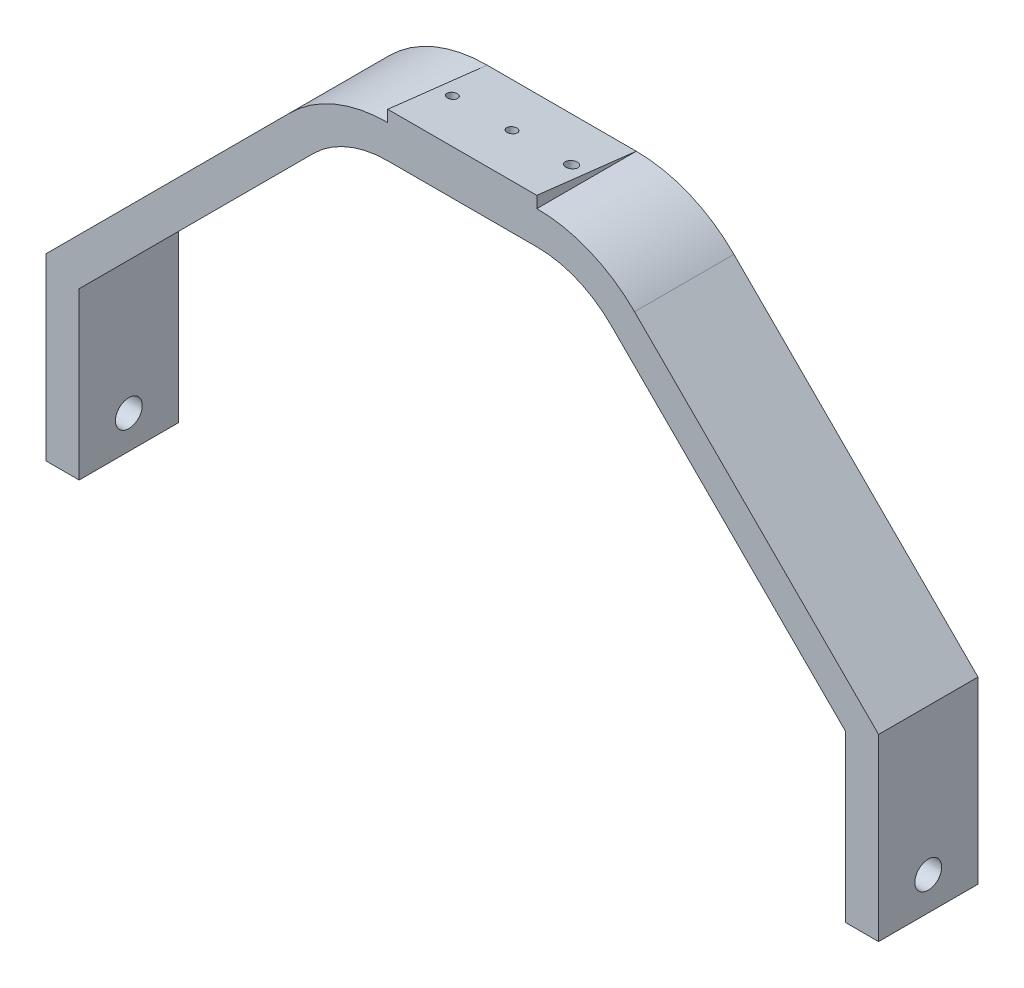
ISO-10303-21;
HEADER;
FILE_DESCRIPTION(('STEP AP214'),'2;1');
FILE_NAME('part.step','',(''),(''),'','','');
FILE_SCHEMA(('AUTOMOTIVE_DESIGN { 1 0 10303 214 1 1 1 1 }'));
ENDSEC;
DATA;
#1=APPLICATION_CONTEXT('core data for automotive mechanical design processes');
#2=APPLICATION_PROTOCOL_DEFINITION('international standard','automotive_design',2000,#1);
#3=PRODUCT_CONTEXT('',#1,'mechanical');
#4=PRODUCT('Part','Part','',(#3));
#5=PRODUCT_RELATED_PRODUCT_CATEGORY('part','',(#4));
#6=PRODUCT_DEFINITION_FORMATION('','',#4);
#7=PRODUCT_DEFINITION_CONTEXT('part definition',#1,'design');
#8=PRODUCT_DEFINITION('design','',#6,#7);
#9=PRODUCT_DEFINITION_SHAPE('','',#8);
#10=(LENGTH_UNIT() NAMED_UNIT(*) SI_UNIT(.MILLI.,.METRE.));
#11=(NAMED_UNIT(*) PLANE_ANGLE_UNIT() SI_UNIT($,.RADIAN.));
#12=(NAMED_UNIT(*) SI_UNIT($,.STERADIAN.) SOLID_ANGLE_UNIT());
#13=UNCERTAINTY_MEASURE_WITH_UNIT(LENGTH_MEASURE(1.E-05),#10,'distance_accuracy_value','');
#14=(GEOMETRIC_REPRESENTATION_CONTEXT(3) GLOBAL_UNCERTAINTY_ASSIGNED_CONTEXT((#13)) GLOBAL_UNIT_ASSIGNED_CONTEXT((#10,
#11,#12)) REPRESENTATION_CONTEXT('',''));
#15=CARTESIAN_POINT('',(0.,0.,0.));
#16=DIRECTION('',(0.,0.,1.));
#17=DIRECTION('',(1.,0.,0.));
#18=AXIS2_PLACEMENT_3D('',#15,#16,#17);
#19=CARTESIAN_POINT('',(22.5,-36.689440670309,30.));
#20=DIRECTION('',(0.,0.,-1.));
#21=DIRECTION('',(-1.,0.,0.));
#22=AXIS2_PLACEMENT_3D('',#19,#20,#21);
#23=CYLINDRICAL_SURFACE('',#22,41.689440670309);
#24=CARTESIAN_POINT('',(22.5,-36.689440670309,0.));
#25=DIRECTION('',(0.,0.,1.));
#26=DIRECTION('',(-1.,0.,0.));
#27=AXIS2_PLACEMENT_3D('',#24,#25,#26);
#28=CIRCLE('',#27,41.689440670309);
#29=CARTESIAN_POINT('',(51.9788862018499,-7.21055446845947,0.));
#30=VERTEX_POINT('',#29);
#31=CARTESIAN_POINT('',(22.5,5.,0.));
#32=VERTEX_POINT('',#31);
#33=EDGE_CURVE('E193',#30,#32,#28,.T.);
#34=ORIENTED_EDGE('',*,*,#33,.T.);
#35=DIRECTION('',(0.,0.,-1.));
#36=VECTOR('',#35,1.);
#37=CARTESIAN_POINT('',(22.5,5.,30.));
#38=LINE('',#37,#36);
#39=CARTESIAN_POINT('',(22.5,5.,30.));
#40=VERTEX_POINT('',#39);
#41=EDGE_CURVE('E11',#40,#32,#38,.T.);
#42=ORIENTED_EDGE('',*,*,#41,.F.);
#43=CARTESIAN_POINT('',(22.5,-36.689440670309,30.));
#44=DIRECTION('',(0.,0.,1.));
#45=DIRECTION('',(-1.,0.,0.));
#46=AXIS2_PLACEMENT_3D('',#43,#44,#45);
#47=CIRCLE('',#46,41.689440670309);
#48=CARTESIAN_POINT('',(51.9788862018499,-7.21055446845947,30.));
#49=VERTEX_POINT('',#48);
#50=EDGE_CURVE('E224',#49,#40,#47,.T.);
#51=ORIENTED_EDGE('',*,*,#50,.F.);
#52=DIRECTION('',(0.,0.,-1.));
#53=VECTOR('',#52,1.);
#54=CARTESIAN_POINT('',(51.9788862018499,-7.21055446845947,30.));
#55=LINE('',#54,#53);
#56=EDGE_CURVE('E189',#49,#30,#55,.T.);
#57=ORIENTED_EDGE('',*,*,#56,.T.);
#58=EDGE_LOOP('',(#34,#42,#51,#57));
#59=FACE_BOUND('',#58,.T.);
#60=ADVANCED_FACE('F44',(#59),#23,.T.);
#61=CARTESIAN_POINT('',(-22.5,-36.689440670309,30.));
#62=DIRECTION('',(0.,0.,-1.));
#63=DIRECTION('',(-1.,0.,0.));
#64=AXIS2_PLACEMENT_3D('',#61,#62,#63);
#65=CYLINDRICAL_SURFACE('',#64,41.689440670309);
#66=CARTESIAN_POINT('',(-22.5,-36.689440670309,0.));
#67=DIRECTION('',(0.,0.,1.));
#68=DIRECTION('',(1.,0.,0.));
#69=AXIS2_PLACEMENT_3D('',#66,#67,#68);
#70=CIRCLE('',#69,41.689440670309);
#71=CARTESIAN_POINT('',(-22.5,5.,0.));
#72=VERTEX_POINT('',#71);
#73=CARTESIAN_POINT('',(-51.9788862018499,-7.21055446845943,0.));
#74=VERTEX_POINT('',#73);
#75=EDGE_CURVE('E196',#72,#74,#70,.T.);
#76=ORIENTED_EDGE('',*,*,#75,.T.);
#77=DIRECTION('',(0.,0.,-1.));
#78=VECTOR('',#77,1.);
#79=CARTESIAN_POINT('',(-51.9788862018499,-7.21055446845943,30.));
#80=LINE('',#79,#78);
#81=CARTESIAN_POINT('',(-51.9788862018499,-7.21055446845943,30.));
#82=VERTEX_POINT('',#81);
#83=EDGE_CURVE('E255',#82,#74,#80,.T.);
#84=ORIENTED_EDGE('',*,*,#83,.F.);
#85=CARTESIAN_POINT('',(-22.5,-36.689440670309,30.));
#86=DIRECTION('',(0.,0.,1.));
#87=DIRECTION('',(1.,0.,0.));
#88=AXIS2_PLACEMENT_3D('',#85,#86,#87);
#89=CIRCLE('',#88,41.689440670309);
#90=CARTESIAN_POINT('',(-22.5,5.,30.));
#91=VERTEX_POINT('',#90);
#92=EDGE_CURVE('E264',#91,#82,#89,.T.);
#93=ORIENTED_EDGE('',*,*,#92,.F.);
#94=DIRECTION('',(0.,0.,-1.));
#95=VECTOR('',#94,1.);
#96=CARTESIAN_POINT('',(-22.5,5.,30.));
#97=LINE('',#96,#95);
#98=EDGE_CURVE('E51',#91,#72,#97,.T.);
#99=ORIENTED_EDGE('',*,*,#98,.T.);
#100=EDGE_LOOP('',(#76,#84,#93,#99));
#101=FACE_BOUND('',#100,.T.);
#102=ADVANCED_FACE('F261',(#101),#65,.T.);
#103=CARTESIAN_POINT('',(-122.689564320504,-77.9212325871146,30.));
#104=DIRECTION('',(0.707106781186551,-0.707106781186544,0.));
#105=DIRECTION('',(0.707106781186544,0.707106781186551,0.));
#106=AXIS2_PLACEMENT_3D('',#103,#104,#105);
#107=PLANE('',#106);
#108=DIRECTION('',(-0.707106781186544,-0.707106781186551,0.));
#109=VECTOR('',#108,1.);
#110=CARTESIAN_POINT('',(-122.689564320504,-77.9212325871146,0.));
#111=LINE('',#110,#109);
#112=CARTESIAN_POINT('',(-125.618496508639,-80.8501647752491,0.));
#113=VERTEX_POINT('',#112);
#114=EDGE_CURVE('E200',#74,#113,#111,.T.);
#115=ORIENTED_EDGE('',*,*,#114,.T.);
#116=DIRECTION('',(0.,0.,-1.));
#117=VECTOR('',#116,1.);
#118=CARTESIAN_POINT('',(-125.618496508639,-80.8501647752491,30.));
#119=LINE('',#118,#117);
#120=CARTESIAN_POINT('',(-125.618496508639,-80.8501647752491,30.));
#121=VERTEX_POINT('',#120);
#122=EDGE_CURVE('E252',#121,#113,#119,.T.);
#123=ORIENTED_EDGE('',*,*,#122,.F.);
#124=DIRECTION('',(-0.707106781186544,-0.707106781186551,0.));
#125=VECTOR('',#124,1.);
#126=CARTESIAN_POINT('',(-51.9788862018499,-7.21055446845943,30.));
#127=LINE('',#126,#125);
#128=EDGE_CURVE('E293',#82,#121,#127,.T.);
#129=ORIENTED_EDGE('',*,*,#128,.F.);
#130=ORIENTED_EDGE('',*,*,#83,.T.);
#131=EDGE_LOOP('',(#115,#123,#129,#130));
#132=FACE_BOUND('',#131,.T.);
#133=ADVANCED_FACE('F284',(#132),#107,.F.);
#134=CARTESIAN_POINT('',(-125.618496508639,-134.99230039898,30.));
#135=DIRECTION('',(1.,0.,0.));
#136=DIRECTION('',(0.,0.,-1.));
#137=AXIS2_PLACEMENT_3D('',#134,#135,#136);
#138=PLANE('',#137);
#139=CARTESIAN_POINT('',(-125.618496508639,-124.99230039898,15.));
#140=DIRECTION('',(-1.,0.,0.));
#141=DIRECTION('',(0.,0.,1.));
#142=AXIS2_PLACEMENT_3D('',#139,#140,#141);
#143=CIRCLE('',#142,4.05);
#144=CARTESIAN_POINT('',(-125.618496508639,-124.99230039898,19.05));
#145=VERTEX_POINT('',#144);
#146=EDGE_CURVE('E332',#145,#145,#143,.T.);
#147=ORIENTED_EDGE('',*,*,#146,.F.);
#148=EDGE_LOOP('',(#147));
#149=FACE_BOUND('',#148,.T.);
#150=DIRECTION('',(0.,-1.,0.));
#151=VECTOR('',#150,1.);
#152=CARTESIAN_POINT('',(-125.618496508639,-134.99230039898,0.));
#153=LINE('',#152,#151);
#154=CARTESIAN_POINT('',(-125.618496508639,-134.99230039898,0.));
#155=VERTEX_POINT('',#154);
#156=EDGE_CURVE('E202',#113,#155,#153,.T.);
#157=ORIENTED_EDGE('',*,*,#156,.T.);
#158=DIRECTION('',(0.,0.,-1.));
#159=VECTOR('',#158,1.);
#160=CARTESIAN_POINT('',(-125.618496508639,-134.99230039898,30.));
#161=LINE('',#160,#159);
#162=CARTESIAN_POINT('',(-125.618496508639,-134.99230039898,30.));
#163=VERTEX_POINT('',#162);
#164=EDGE_CURVE('E249',#163,#155,#161,.T.);
#165=ORIENTED_EDGE('',*,*,#164,.F.);
#166=DIRECTION('',(0.,-1.,0.));
#167=VECTOR('',#166,1.);
#168=CARTESIAN_POINT('',(-125.618496508639,-134.99230039898,30.));
#169=LINE('',#168,#167);
#170=EDGE_CURVE('E290',#121,#163,#169,.T.);
#171=ORIENTED_EDGE('',*,*,#170,.F.);
#172=ORIENTED_EDGE('',*,*,#122,.T.);
#173=EDGE_LOOP('',(#157,#165,#171,#172));
#174=FACE_BOUND('',#173,.T.);
#175=ADVANCED_FACE('F288',(#149,#174),#138,.F.);
#176=CARTESIAN_POINT('',(-115.618496508639,-134.99230039898,30.));
#177=DIRECTION('',(0.,1.,0.));
#178=DIRECTION('',(0.,0.,1.));
#179=AXIS2_PLACEMENT_3D('',#176,#177,#178);
#180=PLANE('',#179);
#181=DIRECTION('',(1.,0.,0.));
#182=VECTOR('',#181,1.);
#183=CARTESIAN_POINT('',(-115.618496508639,-134.99230039898,0.));
#184=LINE('',#183,#182);
#185=CARTESIAN_POINT('',(-115.618496508639,-134.99230039898,0.));
#186=VERTEX_POINT('',#185);
#187=EDGE_CURVE('E204',#155,#186,#184,.T.);
#188=ORIENTED_EDGE('',*,*,#187,.T.);
#189=DIRECTION('',(0.,0.,-1.));
#190=VECTOR('',#189,1.);
#191=CARTESIAN_POINT('',(-115.618496508639,-134.99230039898,30.));
#192=LINE('',#191,#190);
#193=CARTESIAN_POINT('',(-115.618496508639,-134.99230039898,30.));
#194=VERTEX_POINT('',#193);
#195=EDGE_CURVE('E246',#194,#186,#192,.T.);
#196=ORIENTED_EDGE('',*,*,#195,.F.);
#197=DIRECTION('',(1.,0.,0.));
#198=VECTOR('',#197,1.);
#199=CARTESIAN_POINT('',(-115.618496508639,-134.99230039898,30.));
#200=LINE('',#199,#198);
#201=EDGE_CURVE('E292',#163,#194,#200,.T.);
#202=ORIENTED_EDGE('',*,*,#201,.F.);
#203=ORIENTED_EDGE('',*,*,#164,.T.);
#204=EDGE_LOOP('',(#188,#196,#202,#203));
#205=FACE_BOUND('',#204,.T.);
#206=ADVANCED_FACE('F413',(#205),#180,.F.);
#207=CARTESIAN_POINT('',(-115.618496508639,-84.99230039898,30.));
#208=DIRECTION('',(-1.,0.,0.));
#209=DIRECTION('',(0.,0.,1.));
#210=AXIS2_PLACEMENT_3D('',#207,#208,#209);
#211=PLANE('',#210);
#212=CARTESIAN_POINT('',(-115.618496508639,-124.99230039898,15.));
#213=DIRECTION('',(-1.,0.,0.));
#214=DIRECTION('',(0.,0.,1.));
#215=AXIS2_PLACEMENT_3D('',#212,#213,#214);
#216=CIRCLE('',#215,4.05);
#217=CARTESIAN_POINT('',(-115.618496508639,-124.99230039898,19.05));
#218=VERTEX_POINT('',#217);
#219=EDGE_CURVE('E197',#218,#218,#216,.T.);
#220=ORIENTED_EDGE('',*,*,#219,.T.);
#221=EDGE_LOOP('',(#220));
#222=FACE_BOUND('',#221,.T.);
#223=DIRECTION('',(0.,1.,0.));
#224=VECTOR('',#223,1.);
#225=CARTESIAN_POINT('',(-115.618496508639,-84.99230039898,0.));
#226=LINE('',#225,#224);
#227=CARTESIAN_POINT('',(-115.618496508639,-84.99230039898,0.));
#228=VERTEX_POINT('',#227);
#229=EDGE_CURVE('E206',#186,#228,#226,.T.);
#230=ORIENTED_EDGE('',*,*,#229,.T.);
#231=DIRECTION('',(0.,0.,-1.));
#232=VECTOR('',#231,1.);
#233=CARTESIAN_POINT('',(-115.618496508639,-84.99230039898,30.));
#234=LINE('',#233,#232);
#235=CARTESIAN_POINT('',(-115.618496508639,-84.99230039898,30.));
#236=VERTEX_POINT('',#235);
#237=EDGE_CURVE('E243',#236,#228,#234,.T.);
#238=ORIENTED_EDGE('',*,*,#237,.F.);
#239=DIRECTION('',(0.,1.,0.));
#240=VECTOR('',#239,1.);
#241=CARTESIAN_POINT('',(-115.618496508639,-84.99230039898,30.));
#242=LINE('',#241,#240);
#243=EDGE_CURVE('E295',#194,#236,#242,.T.);
#244=ORIENTED_EDGE('',*,*,#243,.F.);
#245=ORIENTED_EDGE('',*,*,#195,.T.);
#246=EDGE_LOOP('',(#230,#238,#244,#245));
#247=FACE_BOUND('',#246,.T.);
#248=ADVANCED_FACE('F417',(#222,#247),#211,.F.);
#249=CARTESIAN_POINT('',(-44.9078183899844,-14.2816222803249,30.));
#250=DIRECTION('',(-0.707106781186551,0.707106781186544,0.));
#251=DIRECTION('',(-0.707106781186544,-0.707106781186551,0.));
#252=AXIS2_PLACEMENT_3D('',#249,#250,#251);
#253=PLANE('',#252);
#254=DIRECTION('',(0.707106781186544,0.707106781186551,0.));
#255=VECTOR('',#254,1.);
#256=CARTESIAN_POINT('',(-44.9078183899844,-14.2816222803249,0.));
#257=LINE('',#256,#255);
#258=CARTESIAN_POINT('',(-44.9078183899844,-14.2816222803249,0.));
#259=VERTEX_POINT('',#258);
#260=EDGE_CURVE('E208',#228,#259,#257,.T.);
#261=ORIENTED_EDGE('',*,*,#260,.T.);
#262=DIRECTION('',(0.,0.,-1.));
#263=VECTOR('',#262,1.);
#264=CARTESIAN_POINT('',(-44.9078183899844,-14.2816222803249,30.));
#265=LINE('',#264,#263);
#266=CARTESIAN_POINT('',(-44.9078183899844,-14.2816222803249,30.));
#267=VERTEX_POINT('',#266);
#268=EDGE_CURVE('E240',#267,#259,#265,.T.);
#269=ORIENTED_EDGE('',*,*,#268,.F.);
#270=DIRECTION('',(0.707106781186544,0.707106781186551,0.));
#271=VECTOR('',#270,1.);
#272=CARTESIAN_POINT('',(-44.9078183899844,-14.2816222803249,30.));
#273=LINE('',#272,#271);
#274=EDGE_CURVE('E301',#236,#267,#273,.T.);
#275=ORIENTED_EDGE('',*,*,#274,.F.);
#276=ORIENTED_EDGE('',*,*,#237,.T.);
#277=EDGE_LOOP('',(#261,#269,#275,#276));
#278=FACE_BOUND('',#277,.T.);
#279=ADVANCED_FACE('F421',(#278),#253,.F.);
#280=CARTESIAN_POINT('',(-22.5,-36.689440670309,30.));
#281=DIRECTION('',(0.,0.,-1.));
#282=DIRECTION('',(-1.,0.,0.));
#283=AXIS2_PLACEMENT_3D('',#280,#281,#282);
#284=CYLINDRICAL_SURFACE('',#283,31.689440670309);
#285=CARTESIAN_POINT('',(-22.5,-36.689440670309,0.));
#286=DIRECTION('',(0.,0.,-1.));
#287=DIRECTION('',(1.,0.,0.));
#288=AXIS2_PLACEMENT_3D('',#285,#286,#287);
#289=CIRCLE('',#288,31.689440670309);
#290=CARTESIAN_POINT('',(-22.5,-5.,0.));
#291=VERTEX_POINT('',#290);
#292=EDGE_CURVE('E210',#259,#291,#289,.T.);
#293=ORIENTED_EDGE('',*,*,#292,.T.);
#294=DIRECTION('',(0.,0.,-1.));
#295=VECTOR('',#294,1.);
#296=CARTESIAN_POINT('',(-22.5,-5.,30.));
#297=LINE('',#296,#295);
#298=CARTESIAN_POINT('',(-22.5,-5.,30.));
#299=VERTEX_POINT('',#298);
#300=EDGE_CURVE('E237',#299,#291,#297,.T.);
#301=ORIENTED_EDGE('',*,*,#300,.F.);
#302=CARTESIAN_POINT('',(-22.5,-36.689440670309,30.));
#303=DIRECTION('',(0.,0.,-1.));
#304=DIRECTION('',(1.,0.,0.));
#305=AXIS2_PLACEMENT_3D('',#302,#303,#304);
#306=CIRCLE('',#305,31.689440670309);
#307=EDGE_CURVE('E303',#267,#299,#306,.T.);
#308=ORIENTED_EDGE('',*,*,#307,.F.);
#309=ORIENTED_EDGE('',*,*,#268,.T.);
#310=EDGE_LOOP('',(#293,#301,#308,#309));
#311=FACE_BOUND('',#310,.T.);
#312=ADVANCED_FACE('F383',(#311),#284,.F.);
#313=CARTESIAN_POINT('',(-22.5,-5.,30.));
#314=DIRECTION('',(0.,1.,0.));
#315=DIRECTION('',(0.,0.,1.));
#316=AXIS2_PLACEMENT_3D('',#313,#314,#315);
#317=PLANE('',#316);
#318=CARTESIAN_POINT('',(18.,-5.,16.3578505293645));
#319=DIRECTION('',(0.,1.,0.));
#320=DIRECTION('',(0.,0.,-1.));
#321=AXIS2_PLACEMENT_3D('',#318,#319,#320);
#322=ELLIPSE('',#321,1.74657496166745,1.735);
#323=CARTESIAN_POINT('',(18.,-5.,14.6112755676971));
#324=VERTEX_POINT('',#323);
#325=EDGE_CURVE('E343',#324,#324,#322,.T.);
#326=ORIENTED_EDGE('',*,*,#325,.T.);
#327=EDGE_LOOP('',(#326));
#328=FACE_BOUND('',#327,.T.);
#329=CARTESIAN_POINT('',(-18.,-5.,16.3578505293645));
#330=DIRECTION('',(0.,1.,0.));
#331=DIRECTION('',(0.,0.,-1.));
#332=AXIS2_PLACEMENT_3D('',#329,#330,#331);
#333=ELLIPSE('',#332,1.51000717147042,1.5);
#334=CARTESIAN_POINT('',(-18.,-5.,14.8478433578941));
#335=VERTEX_POINT('',#334);
#336=EDGE_CURVE('E346',#335,#335,#333,.T.);
#337=ORIENTED_EDGE('',*,*,#336,.T.);
#338=EDGE_LOOP('',(#337));
#339=FACE_BOUND('',#338,.T.);
#340=CARTESIAN_POINT('',(0.,-5.,16.3578505293645));
#341=DIRECTION('',(0.,1.,0.));
#342=DIRECTION('',(0.,0.,-1.));
#343=AXIS2_PLACEMENT_3D('',#340,#341,#342);
#344=ELLIPSE('',#343,1.51000717147042,1.5);
#345=CARTESIAN_POINT('',(0.,-5.,14.8478433578941));
#346=VERTEX_POINT('',#345);
#347=EDGE_CURVE('E349',#346,#346,#344,.T.);
#348=ORIENTED_EDGE('',*,*,#347,.T.);
#349=EDGE_LOOP('',(#348));
#350=FACE_BOUND('',#349,.T.);
#351=DIRECTION('',(1.,0.,0.));
#352=VECTOR('',#351,1.);
#353=CARTESIAN_POINT('',(-22.5,-5.,0.));
#354=LINE('',#353,#352);
#355=CARTESIAN_POINT('',(22.5,-5.,0.));
#356=VERTEX_POINT('',#355);
#357=EDGE_CURVE('E212',#291,#356,#354,.T.);
#358=ORIENTED_EDGE('',*,*,#357,.T.);
#359=DIRECTION('',(0.,0.,-1.));
#360=VECTOR('',#359,1.);
#361=CARTESIAN_POINT('',(22.5,-5.,30.));
#362=LINE('',#361,#360);
#363=CARTESIAN_POINT('',(22.5,-5.,30.));
#364=VERTEX_POINT('',#363);
#365=EDGE_CURVE('E234',#364,#356,#362,.T.);
#366=ORIENTED_EDGE('',*,*,#365,.F.);
#367=DIRECTION('',(1.,0.,0.));
#368=VECTOR('',#367,1.);
#369=CARTESIAN_POINT('',(-22.5,-5.,30.));
#370=LINE('',#369,#368);
#371=EDGE_CURVE('E305',#299,#364,#370,.T.);
#372=ORIENTED_EDGE('',*,*,#371,.F.);
#373=ORIENTED_EDGE('',*,*,#300,.T.);
#374=EDGE_LOOP('',(#358,#366,#372,#373));
#375=FACE_BOUND('',#374,.T.);
#376=ADVANCED_FACE('F379',(#328,#339,#350,#375),#317,.F.);
#377=CARTESIAN_POINT('',(22.5,-36.689440670309,30.));
#378=DIRECTION('',(0.,0.,-1.));
#379=DIRECTION('',(-1.,0.,0.));
#380=AXIS2_PLACEMENT_3D('',#377,#378,#379);
#381=CYLINDRICAL_SURFACE('',#380,31.689440670309);
#382=CARTESIAN_POINT('',(22.5,-36.689440670309,0.));
#383=DIRECTION('',(0.,0.,-1.));
#384=DIRECTION('',(-1.,0.,0.));
#385=AXIS2_PLACEMENT_3D('',#382,#383,#384);
#386=CIRCLE('',#385,31.689440670309);
#387=CARTESIAN_POINT('',(44.9078183899844,-14.2816222803249,0.));
#388=VERTEX_POINT('',#387);
#389=EDGE_CURVE('E214',#356,#388,#386,.T.);
#390=ORIENTED_EDGE('',*,*,#389,.T.);
#391=DIRECTION('',(0.,0.,-1.));
#392=VECTOR('',#391,1.);
#393=CARTESIAN_POINT('',(44.9078183899844,-14.2816222803249,30.));
#394=LINE('',#393,#392);
#395=CARTESIAN_POINT('',(44.9078183899844,-14.2816222803249,30.));
#396=VERTEX_POINT('',#395);
#397=EDGE_CURVE('E231',#396,#388,#394,.T.);
#398=ORIENTED_EDGE('',*,*,#397,.F.);
#399=CARTESIAN_POINT('',(22.5,-36.689440670309,30.));
#400=DIRECTION('',(0.,0.,-1.));
#401=DIRECTION('',(-1.,0.,0.));
#402=AXIS2_PLACEMENT_3D('',#399,#400,#401);
#403=CIRCLE('',#402,31.689440670309);
#404=EDGE_CURVE('E307',#364,#396,#403,.T.);
#405=ORIENTED_EDGE('',*,*,#404,.F.);
#406=ORIENTED_EDGE('',*,*,#365,.T.);
#407=EDGE_LOOP('',(#390,#398,#405,#406));
#408=FACE_BOUND('',#407,.T.);
#409=ADVANCED_FACE('F382',(#408),#381,.F.);
#410=CARTESIAN_POINT('',(44.9078183899844,-14.2816222803249,30.));
#411=DIRECTION('',(0.707106781186552,0.707106781186543,0.));
#412=DIRECTION('',(-0.707106781186543,0.707106781186552,0.));
#413=AXIS2_PLACEMENT_3D('',#410,#411,#412);
#414=PLANE('',#413);
#415=DIRECTION('',(0.707106781186543,-0.707106781186552,0.));
#416=VECTOR('',#415,1.);
#417=CARTESIAN_POINT('',(44.9078183899844,-14.2816222803249,0.));
#418=LINE('',#417,#416);
#419=CARTESIAN_POINT('',(115.618496508639,-84.9923003989801,0.));
#420=VERTEX_POINT('',#419);
#421=EDGE_CURVE('E216',#388,#420,#418,.T.);
#422=ORIENTED_EDGE('',*,*,#421,.T.);
#423=DIRECTION('',(0.,0.,-1.));
#424=VECTOR('',#423,1.);
#425=CARTESIAN_POINT('',(115.618496508639,-84.9923003989801,30.));
#426=LINE('',#425,#424);
#427=CARTESIAN_POINT('',(115.618496508639,-84.9923003989801,30.));
#428=VERTEX_POINT('',#427);
#429=EDGE_CURVE('E228',#428,#420,#426,.T.);
#430=ORIENTED_EDGE('',*,*,#429,.F.);
#431=DIRECTION('',(0.707106781186543,-0.707106781186552,0.));
#432=VECTOR('',#431,1.);
#433=CARTESIAN_POINT('',(44.9078183899844,-14.2816222803249,30.));
#434=LINE('',#433,#432);
#435=EDGE_CURVE('E309',#396,#428,#434,.T.);
#436=ORIENTED_EDGE('',*,*,#435,.F.);
#437=ORIENTED_EDGE('',*,*,#397,.T.);
#438=EDGE_LOOP('',(#422,#430,#436,#437));
#439=FACE_BOUND('',#438,.T.);
#440=ADVANCED_FACE('F315',(#439),#414,.F.);
#441=CARTESIAN_POINT('',(115.618496508639,-84.9923003989801,30.));
#442=DIRECTION('',(1.,0.,0.));
#443=DIRECTION('',(0.,1.,0.));
#444=AXIS2_PLACEMENT_3D('',#441,#442,#443);
#445=PLANE('',#444);
#446=CARTESIAN_POINT('',(115.618496508639,-124.99230039898,15.));
#447=DIRECTION('',(1.,0.,0.));
#448=DIRECTION('',(0.,1.,0.));
#449=AXIS2_PLACEMENT_3D('',#446,#447,#448);
#450=CIRCLE('',#449,4.05);
#451=CARTESIAN_POINT('',(115.618496508639,-120.94230039898,15.));
#452=VERTEX_POINT('',#451);
#453=EDGE_CURVE('E328',#452,#452,#450,.T.);
#454=ORIENTED_EDGE('',*,*,#453,.T.);
#455=EDGE_LOOP('',(#454));
#456=FACE_BOUND('',#455,.T.);
#457=DIRECTION('',(0.,-1.,0.));
#458=VECTOR('',#457,1.);
#459=CARTESIAN_POINT('',(115.618496508639,-84.9923003989801,0.));
#460=LINE('',#459,#458);
#461=CARTESIAN_POINT('',(115.618496508639,-134.99230039898,0.));
#462=VERTEX_POINT('',#461);
#463=EDGE_CURVE('E218',#420,#462,#460,.T.);
#464=ORIENTED_EDGE('',*,*,#463,.T.);
#465=DIRECTION('',(0.,0.,-1.));
#466=VECTOR('',#465,1.);
#467=CARTESIAN_POINT('',(115.618496508639,-134.99230039898,30.));
#468=LINE('',#467,#466);
#469=CARTESIAN_POINT('',(115.618496508639,-134.99230039898,30.));
#470=VERTEX_POINT('',#469);
#471=EDGE_CURVE('E184',#470,#462,#468,.T.);
#472=ORIENTED_EDGE('',*,*,#471,.F.);
#473=DIRECTION('',(0.,-1.,0.));
#474=VECTOR('',#473,1.);
#475=CARTESIAN_POINT('',(115.618496508639,-84.9923003989801,30.));
#476=LINE('',#475,#474);
#477=EDGE_CURVE('E171',#428,#470,#476,.T.);
#478=ORIENTED_EDGE('',*,*,#477,.F.);
#479=ORIENTED_EDGE('',*,*,#429,.T.);
#480=EDGE_LOOP('',(#464,#472,#478,#479));
#481=FACE_BOUND('',#480,.T.);
#482=ADVANCED_FACE('F319',(#456,#481),#445,.F.);
#483=CARTESIAN_POINT('',(115.618496508639,-134.99230039898,30.));
#484=DIRECTION('',(0.,1.,0.));
#485=DIRECTION('',(0.,0.,1.));
#486=AXIS2_PLACEMENT_3D('',#483,#484,#485);
#487=PLANE('',#486);
#488=DIRECTION('',(1.,0.,0.));
#489=VECTOR('',#488,1.);
#490=CARTESIAN_POINT('',(115.618496508639,-134.99230039898,0.));
#491=LINE('',#490,#489);
#492=CARTESIAN_POINT('',(125.618496508639,-134.99230039898,0.));
#493=VERTEX_POINT('',#492);
#494=EDGE_CURVE('E180',#462,#493,#491,.T.);
#495=ORIENTED_EDGE('',*,*,#494,.T.);
#496=DIRECTION('',(0.,0.,-1.));
#497=VECTOR('',#496,1.);
#498=CARTESIAN_POINT('',(125.618496508639,-134.99230039898,30.));
#499=LINE('',#498,#497);
#500=CARTESIAN_POINT('',(125.618496508639,-134.99230039898,30.));
#501=VERTEX_POINT('',#500);
#502=EDGE_CURVE('E177',#501,#493,#499,.T.);
#503=ORIENTED_EDGE('',*,*,#502,.F.);
#504=DIRECTION('',(1.,0.,0.));
#505=VECTOR('',#504,1.);
#506=CARTESIAN_POINT('',(115.618496508639,-134.99230039898,30.));
#507=LINE('',#506,#505);
#508=EDGE_CURVE('E164',#470,#501,#507,.T.);
#509=ORIENTED_EDGE('',*,*,#508,.F.);
#510=ORIENTED_EDGE('',*,*,#471,.T.);
#511=EDGE_LOOP('',(#495,#503,#509,#510));
#512=FACE_BOUND('',#511,.T.);
#513=ADVANCED_FACE('F178',(#512),#487,.F.);
#514=CARTESIAN_POINT('',(125.618496508639,-134.99230039898,30.));
#515=DIRECTION('',(-1.,0.,0.));
#516=DIRECTION('',(0.,-1.,0.));
#517=AXIS2_PLACEMENT_3D('',#514,#515,#516);
#518=PLANE('',#517);
#519=CARTESIAN_POINT('',(125.618496508639,-124.99230039898,15.));
#520=DIRECTION('',(-1.,0.,0.));
#521=DIRECTION('',(0.,0.,1.));
#522=AXIS2_PLACEMENT_3D('',#519,#520,#521);
#523=CIRCLE('',#522,4.05);
#524=CARTESIAN_POINT('',(125.618496508639,-124.99230039898,19.05));
#525=VERTEX_POINT('',#524);
#526=EDGE_CURVE('E331',#525,#525,#523,.T.);
#527=ORIENTED_EDGE('',*,*,#526,.T.);
#528=EDGE_LOOP('',(#527));
#529=FACE_BOUND('',#528,.T.);
#530=DIRECTION('',(0.,1.,0.));
#531=VECTOR('',#530,1.);
#532=CARTESIAN_POINT('',(125.618496508639,-134.99230039898,0.));
#533=LINE('',#532,#531);
#534=CARTESIAN_POINT('',(125.618496508639,-80.8501647752492,0.));
#535=VERTEX_POINT('',#534);
#536=EDGE_CURVE('E221',#493,#535,#533,.T.);
#537=ORIENTED_EDGE('',*,*,#536,.T.);
#538=DIRECTION('',(0.,0.,-1.));
#539=VECTOR('',#538,1.);
#540=CARTESIAN_POINT('',(125.618496508639,-80.8501647752492,30.));
#541=LINE('',#540,#539);
#542=CARTESIAN_POINT('',(125.618496508639,-80.8501647752492,30.));
#543=VERTEX_POINT('',#542);
#544=EDGE_CURVE('E185',#543,#535,#541,.T.);
#545=ORIENTED_EDGE('',*,*,#544,.F.);
#546=DIRECTION('',(0.,1.,0.));
#547=VECTOR('',#546,1.);
#548=CARTESIAN_POINT('',(125.618496508639,-134.99230039898,30.));
#549=LINE('',#548,#547);
#550=EDGE_CURVE('E168',#501,#543,#549,.T.);
#551=ORIENTED_EDGE('',*,*,#550,.F.);
#552=ORIENTED_EDGE('',*,*,#502,.T.);
#553=EDGE_LOOP('',(#537,#545,#551,#552));
#554=FACE_BOUND('',#553,.T.);
#555=ADVANCED_FACE('F187',(#529,#554),#518,.F.);
#556=CARTESIAN_POINT('',(51.9788862018499,-7.21055446845947,30.));
#557=DIRECTION('',(-0.707106781186552,-0.707106781186543,0.));
#558=DIRECTION('',(0.707106781186543,-0.707106781186552,0.));
#559=AXIS2_PLACEMENT_3D('',#556,#557,#558);
#560=PLANE('',#559);
#561=DIRECTION('',(-0.707106781186543,0.707106781186552,0.));
#562=VECTOR('',#561,1.);
#563=CARTESIAN_POINT('',(51.9788862018499,-7.21055446845947,0.));
#564=LINE('',#563,#562);
#565=EDGE_CURVE('E117',#535,#30,#564,.T.);
#566=ORIENTED_EDGE('',*,*,#565,.T.);
#567=ORIENTED_EDGE('',*,*,#56,.F.);
#568=DIRECTION('',(-0.707106781186544,0.707106781186551,0.));
#569=VECTOR('',#568,1.);
#570=CARTESIAN_POINT('',(122.689564320504,-77.9212325871147,30.));
#571=LINE('',#570,#569);
#572=EDGE_CURVE('E67',#543,#49,#571,.T.);
#573=ORIENTED_EDGE('',*,*,#572,.F.);
#574=ORIENTED_EDGE('',*,*,#544,.T.);
#575=EDGE_LOOP('',(#566,#567,#573,#574));
#576=FACE_BOUND('',#575,.T.);
#577=ADVANCED_FACE('F320',(#576),#560,.F.);
#578=CARTESIAN_POINT('',(22.5,-36.689440670309,30.));
#579=DIRECTION('',(0.,0.,-1.));
#580=DIRECTION('',(-1.,0.,0.));
#581=AXIS2_PLACEMENT_3D('',#578,#579,#580);
#582=PLANE('',#581);
#583=DIRECTION('',(0.,-1.,0.));
#584=VECTOR('',#583,1.);
#585=CARTESIAN_POINT('',(22.5,17.,30.));
#586=LINE('',#585,#584);
#587=CARTESIAN_POINT('',(22.5,8.47111843025185,30.));
#588=VERTEX_POINT('',#587);
#589=EDGE_CURVE('E124',#588,#40,#586,.T.);
#590=ORIENTED_EDGE('',*,*,#589,.F.);
#591=DIRECTION('',(1.,0.,0.));
#592=VECTOR('',#591,1.);
#593=CARTESIAN_POINT('',(-125.618496508639,8.47111843025185,30.));
#594=LINE('',#593,#592);
#595=CARTESIAN_POINT('',(-22.5,8.47111843025185,30.));
#596=VERTEX_POINT('',#595);
#597=EDGE_CURVE('E58',#596,#588,#594,.T.);
#598=ORIENTED_EDGE('',*,*,#597,.F.);
#599=DIRECTION('',(0.,-1.,0.));
#600=VECTOR('',#599,1.);
#601=CARTESIAN_POINT('',(-22.5,17.,30.));
#602=LINE('',#601,#600);
#603=EDGE_CURVE('E271',#596,#91,#602,.T.);
#604=ORIENTED_EDGE('',*,*,#603,.T.);
#605=ORIENTED_EDGE('',*,*,#92,.T.);
#606=ORIENTED_EDGE('',*,*,#128,.T.);
#607=ORIENTED_EDGE('',*,*,#170,.T.);
#608=ORIENTED_EDGE('',*,*,#201,.T.);
#609=ORIENTED_EDGE('',*,*,#243,.T.);
#610=ORIENTED_EDGE('',*,*,#274,.T.);
#611=ORIENTED_EDGE('',*,*,#307,.T.);
#612=ORIENTED_EDGE('',*,*,#371,.T.);
#613=ORIENTED_EDGE('',*,*,#404,.T.);
#614=ORIENTED_EDGE('',*,*,#435,.T.);
#615=ORIENTED_EDGE('',*,*,#477,.T.);
#616=ORIENTED_EDGE('',*,*,#508,.T.);
#617=ORIENTED_EDGE('',*,*,#550,.T.);
#618=ORIENTED_EDGE('',*,*,#572,.T.);
#619=ORIENTED_EDGE('',*,*,#50,.T.);
#620=EDGE_LOOP('',(#590,#598,#604,#605,#606,#607,#608,#609,#610,#611,#612,#613,#614,#615,#616,
#617,#618,#619));
#621=FACE_BOUND('',#620,.T.);
#622=ADVANCED_FACE('F166',(#621),#582,.F.);
#623=CARTESIAN_POINT('',(22.5,-36.689440670309,0.));
#624=DIRECTION('',(0.,0.,-1.));
#625=DIRECTION('',(-1.,0.,0.));
#626=AXIS2_PLACEMENT_3D('',#623,#624,#625);
#627=PLANE('',#626);
#628=DIRECTION('',(1.,0.,0.));
#629=VECTOR('',#628,1.);
#630=CARTESIAN_POINT('',(-125.618496508639,5.,0.));
#631=LINE('',#630,#629);
#632=EDGE_CURVE('E273',#72,#32,#631,.T.);
#633=ORIENTED_EDGE('',*,*,#632,.T.);
#634=ORIENTED_EDGE('',*,*,#33,.F.);
#635=ORIENTED_EDGE('',*,*,#565,.F.);
#636=ORIENTED_EDGE('',*,*,#536,.F.);
#637=ORIENTED_EDGE('',*,*,#494,.F.);
#638=ORIENTED_EDGE('',*,*,#463,.F.);
#639=ORIENTED_EDGE('',*,*,#421,.F.);
#640=ORIENTED_EDGE('',*,*,#389,.F.);
#641=ORIENTED_EDGE('',*,*,#357,.F.);
#642=ORIENTED_EDGE('',*,*,#292,.F.);
#643=ORIENTED_EDGE('',*,*,#260,.F.);
#644=ORIENTED_EDGE('',*,*,#229,.F.);
#645=ORIENTED_EDGE('',*,*,#187,.F.);
#646=ORIENTED_EDGE('',*,*,#156,.F.);
#647=ORIENTED_EDGE('',*,*,#114,.F.);
#648=ORIENTED_EDGE('',*,*,#75,.F.);
#649=EDGE_LOOP('',(#633,#634,#635,#636,#637,#638,#639,#640,#641,#642,#643,#644,#645,#646,#647,#648));
#650=FACE_BOUND('',#649,.T.);
#651=ADVANCED_FACE('F277',(#650),#627,.T.);
#652=CARTESIAN_POINT('',(125.618496508639,-124.99230039898,15.));
#653=DIRECTION('',(-1.,0.,0.));
#654=DIRECTION('',(0.,0.,1.));
#655=AXIS2_PLACEMENT_3D('',#652,#653,#654);
#656=CYLINDRICAL_SURFACE('',#655,4.05);
#657=ORIENTED_EDGE('',*,*,#526,.F.);
#658=EDGE_LOOP('',(#657));
#659=FACE_BOUND('',#658,.T.);
#660=ORIENTED_EDGE('',*,*,#453,.F.);
#661=EDGE_LOOP('',(#660));
#662=FACE_BOUND('',#661,.T.);
#663=ADVANCED_FACE('F495',(#659,#662),#656,.F.);
#664=ORIENTED_EDGE('',*,*,#146,.T.);
#665=EDGE_LOOP('',(#664));
#666=FACE_BOUND('',#665,.T.);
#667=ORIENTED_EDGE('',*,*,#219,.F.);
#668=EDGE_LOOP('',(#667));
#669=FACE_BOUND('',#668,.T.);
#670=ADVANCED_FACE('F498',(#666,#669),#656,.F.);
#671=CARTESIAN_POINT('',(-22.5,17.,0.));
#672=DIRECTION('',(1.,0.,0.));
#673=DIRECTION('',(0.,0.,-1.));
#674=AXIS2_PLACEMENT_3D('',#671,#672,#673);
#675=PLANE('',#674);
#676=ORIENTED_EDGE('',*,*,#603,.F.);
#677=DIRECTION('',(0.,-0.11493715049286,-0.993372765600397));
#678=VECTOR('',#677,1.);
#679=CARTESIAN_POINT('',(-22.5,5.15852658276102,1.37010522066386));
#680=LINE('',#679,#678);
#681=EDGE_CURVE('E272',#596,#72,#680,.T.);
#682=ORIENTED_EDGE('',*,*,#681,.T.);
#683=ORIENTED_EDGE('',*,*,#98,.F.);
#684=EDGE_LOOP('',(#676,#682,#683));
#685=FACE_BOUND('',#684,.T.);
#686=ADVANCED_FACE('F270',(#685),#675,.F.);
#687=CARTESIAN_POINT('',(22.5,17.,0.));
#688=DIRECTION('',(-1.,0.,0.));
#689=DIRECTION('',(0.,0.,1.));
#690=AXIS2_PLACEMENT_3D('',#687,#688,#689);
#691=PLANE('',#690);
#692=ORIENTED_EDGE('',*,*,#41,.T.);
#693=DIRECTION('',(0.,-0.11493715049286,-0.993372765600397));
#694=VECTOR('',#693,1.);
#695=CARTESIAN_POINT('',(22.5,5.,0.));
#696=LINE('',#695,#694);
#697=EDGE_CURVE('E340',#588,#32,#696,.T.);
#698=ORIENTED_EDGE('',*,*,#697,.F.);
#699=ORIENTED_EDGE('',*,*,#589,.T.);
#700=EDGE_LOOP('',(#692,#698,#699));
#701=FACE_BOUND('',#700,.T.);
#702=ADVANCED_FACE('F369',(#701),#691,.F.);
#703=CARTESIAN_POINT('',(-125.618496508639,5.,0.));
#704=DIRECTION('',(0.,-0.993372765600397,0.11493715049286));
#705=DIRECTION('',(0.,-0.11493715049286,-0.993372765600397));
#706=AXIS2_PLACEMENT_3D('',#703,#704,#705);
#707=PLANE('',#706);
#708=CARTESIAN_POINT('',(18.,6.73555921512593,15.));
#709=DIRECTION('',(0.,0.993372765600397,-0.11493715049286));
#710=DIRECTION('',(0.,0.11493715049286,0.993372765600397));
#711=AXIS2_PLACEMENT_3D('',#708,#709,#710);
#712=CIRCLE('',#711,1.735);
#713=CARTESIAN_POINT('',(18.,6.93497517123104,16.7235017483167));
#714=VERTEX_POINT('',#713);
#715=EDGE_CURVE('E356',#714,#714,#712,.T.);
#716=ORIENTED_EDGE('',*,*,#715,.F.);
#717=EDGE_LOOP('',(#716));
#718=FACE_BOUND('',#717,.T.);
#719=CARTESIAN_POINT('',(-18.,6.73555921512593,15.));
#720=DIRECTION('',(0.,0.993372765600397,-0.11493715049286));
#721=DIRECTION('',(0.,0.11493715049286,0.993372765600397));
#722=AXIS2_PLACEMENT_3D('',#719,#720,#721);
#723=CIRCLE('',#722,1.5);
#724=CARTESIAN_POINT('',(-18.,6.90796494086522,16.4900591484006));
#725=VERTEX_POINT('',#724);
#726=EDGE_CURVE('E355',#725,#725,#723,.T.);
#727=ORIENTED_EDGE('',*,*,#726,.F.);
#728=EDGE_LOOP('',(#727));
#729=FACE_BOUND('',#728,.T.);
#730=CARTESIAN_POINT('',(0.,6.73555921512593,15.));
#731=DIRECTION('',(0.,0.993372765600397,-0.11493715049286));
#732=DIRECTION('',(0.,0.11493715049286,0.993372765600397));
#733=AXIS2_PLACEMENT_3D('',#730,#731,#732);
#734=CIRCLE('',#733,1.5);
#735=CARTESIAN_POINT('',(0.,6.90796494086522,16.4900591484006));
#736=VERTEX_POINT('',#735);
#737=EDGE_CURVE('E352',#736,#736,#734,.T.);
#738=ORIENTED_EDGE('',*,*,#737,.F.);
#739=EDGE_LOOP('',(#738));
#740=FACE_BOUND('',#739,.T.);
#741=ORIENTED_EDGE('',*,*,#597,.T.);
#742=ORIENTED_EDGE('',*,*,#697,.T.);
#743=ORIENTED_EDGE('',*,*,#632,.F.);
#744=ORIENTED_EDGE('',*,*,#681,.F.);
#745=EDGE_LOOP('',(#741,#742,#743,#744));
#746=FACE_BOUND('',#745,.T.);
#747=ADVANCED_FACE('F365',(#718,#729,#740,#746),#707,.F.);
#748=CARTESIAN_POINT('',(0.,-11.1451505656812,17.0688687088715));
#749=DIRECTION('',(0.,0.993372765600397,-0.11493715049286));
#750=DIRECTION('',(0.,0.11493715049286,0.993372765600397));
#751=AXIS2_PLACEMENT_3D('',#748,#749,#750);
#752=CYLINDRICAL_SURFACE('',#751,1.5);
#753=ORIENTED_EDGE('',*,*,#737,.T.);
#754=EDGE_LOOP('',(#753));
#755=FACE_BOUND('',#754,.T.);
#756=ORIENTED_EDGE('',*,*,#347,.F.);
#757=EDGE_LOOP('',(#756));
#758=FACE_BOUND('',#757,.T.);
#759=ADVANCED_FACE('F368',(#755,#758),#752,.F.);
#760=CARTESIAN_POINT('',(-18.,-11.1451505656812,17.0688687088715));
#761=DIRECTION('',(0.,0.993372765600397,-0.11493715049286));
#762=DIRECTION('',(0.,0.11493715049286,0.993372765600397));
#763=AXIS2_PLACEMENT_3D('',#760,#761,#762);
#764=CYLINDRICAL_SURFACE('',#763,1.5);
#765=ORIENTED_EDGE('',*,*,#726,.T.);
#766=EDGE_LOOP('',(#765));
#767=FACE_BOUND('',#766,.T.);
#768=ORIENTED_EDGE('',*,*,#336,.F.);
#769=EDGE_LOOP('',(#768));
#770=FACE_BOUND('',#769,.T.);
#771=ADVANCED_FACE('F362',(#767,#770),#764,.F.);
#772=CARTESIAN_POINT('',(18.,-11.1451505656812,17.0688687088715));
#773=DIRECTION('',(0.,0.993372765600397,-0.11493715049286));
#774=DIRECTION('',(0.,0.11493715049286,0.993372765600397));
#775=AXIS2_PLACEMENT_3D('',#772,#773,#774);
#776=CYLINDRICAL_SURFACE('',#775,1.735);
#777=ORIENTED_EDGE('',*,*,#715,.T.);
#778=EDGE_LOOP('',(#777));
#779=FACE_BOUND('',#778,.T.);
#780=ORIENTED_EDGE('',*,*,#325,.F.);
#781=EDGE_LOOP('',(#780));
#782=FACE_BOUND('',#781,.T.);
#783=ADVANCED_FACE('F577',(#779,#782),#776,.F.);
#784=CLOSED_SHELL('',(#60,#102,#133,#175,#206,#248,#279,#312,#376,#409,#440,#482,#513,#555,#577,
#622,#651,#663,#670,#686,#702,#747,#759,#771,#783));
#785=MANIFOLD_SOLID_BREP('B2',#784);
#786=ADVANCED_BREP_SHAPE_REPRESENTATION('',(#18,#785),#14);
#787=SHAPE_DEFINITION_REPRESENTATION(#9,#786);
ENDSEC;
END-ISO-10303-21;
